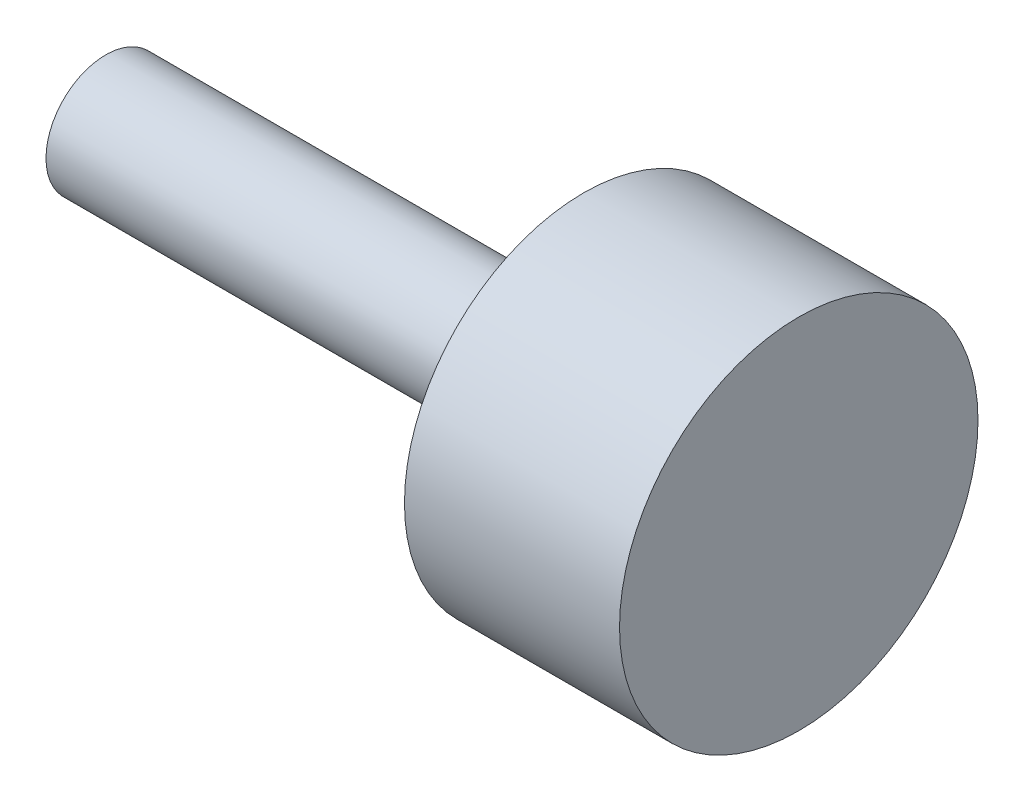
ISO-10303-21;
HEADER;
FILE_DESCRIPTION(('STEP AP214'),'2;1');
FILE_NAME('part.step','',(''),(''),'','','');
FILE_SCHEMA(('AUTOMOTIVE_DESIGN { 1 0 10303 214 1 1 1 1 }'));
ENDSEC;
DATA;
#1=APPLICATION_CONTEXT('core data for automotive mechanical design processes');
#2=APPLICATION_PROTOCOL_DEFINITION('international standard','automotive_design',2000,#1);
#3=PRODUCT_CONTEXT('',#1,'mechanical');
#4=PRODUCT('Part','Part','',(#3));
#5=PRODUCT_RELATED_PRODUCT_CATEGORY('part','',(#4));
#6=PRODUCT_DEFINITION_FORMATION('','',#4);
#7=PRODUCT_DEFINITION_CONTEXT('part definition',#1,'design');
#8=PRODUCT_DEFINITION('design','',#6,#7);
#9=PRODUCT_DEFINITION_SHAPE('','',#8);
#10=(LENGTH_UNIT() NAMED_UNIT(*) SI_UNIT(.MILLI.,.METRE.));
#11=(NAMED_UNIT(*) PLANE_ANGLE_UNIT() SI_UNIT($,.RADIAN.));
#12=(NAMED_UNIT(*) SI_UNIT($,.STERADIAN.) SOLID_ANGLE_UNIT());
#13=UNCERTAINTY_MEASURE_WITH_UNIT(LENGTH_MEASURE(1.E-05),#10,'distance_accuracy_value','');
#14=(GEOMETRIC_REPRESENTATION_CONTEXT(3) GLOBAL_UNCERTAINTY_ASSIGNED_CONTEXT((#13)) GLOBAL_UNIT_ASSIGNED_CONTEXT((#10,
#11,#12)) REPRESENTATION_CONTEXT('',''));
#15=CARTESIAN_POINT('',(0.,0.,0.));
#16=DIRECTION('',(0.,0.,1.));
#17=DIRECTION('',(1.,0.,0.));
#18=AXIS2_PLACEMENT_3D('',#15,#16,#17);
#19=CARTESIAN_POINT('',(-20.,0.,0.));
#20=DIRECTION('',(-1.,0.,0.));
#21=DIRECTION('',(0.,0.,1.));
#22=AXIS2_PLACEMENT_3D('',#19,#20,#21);
#23=PLANE('',#22);
#24=CARTESIAN_POINT('',(-20.,0.,0.));
#25=DIRECTION('',(-1.,0.,0.));
#26=DIRECTION('',(0.,0.,1.));
#27=AXIS2_PLACEMENT_3D('',#24,#25,#26);
#28=CIRCLE('',#27,2.5);
#29=CARTESIAN_POINT('',(-20.,0.,2.5));
#30=VERTEX_POINT('',#29);
#31=EDGE_CURVE('E10',#30,#30,#28,.T.);
#32=ORIENTED_EDGE('',*,*,#31,.T.);
#33=EDGE_LOOP('',(#32));
#34=FACE_BOUND('',#33,.T.);
#35=ADVANCED_FACE('F15',(#34),#23,.T.);
#36=CARTESIAN_POINT('',(-20.,0.,0.));
#37=DIRECTION('',(1.,0.,0.));
#38=DIRECTION('',(0.,0.,-1.));
#39=AXIS2_PLACEMENT_3D('',#36,#37,#38);
#40=CYLINDRICAL_SURFACE('',#39,2.5);
#41=ORIENTED_EDGE('',*,*,#31,.F.);
#42=EDGE_LOOP('',(#41));
#43=FACE_BOUND('',#42,.T.);
#44=CARTESIAN_POINT('',(0.,0.,0.));
#45=DIRECTION('',(-1.,0.,0.));
#46=DIRECTION('',(0.,0.,1.));
#47=AXIS2_PLACEMENT_3D('',#44,#45,#46);
#48=CIRCLE('',#47,2.5);
#49=CARTESIAN_POINT('',(0.,0.,2.5));
#50=VERTEX_POINT('',#49);
#51=EDGE_CURVE('E22',#50,#50,#48,.T.);
#52=ORIENTED_EDGE('',*,*,#51,.T.);
#53=EDGE_LOOP('',(#52));
#54=FACE_BOUND('',#53,.T.);
#55=ADVANCED_FACE('F52',(#43,#54),#40,.T.);
#56=CARTESIAN_POINT('',(0.,0.,0.));
#57=DIRECTION('',(1.,0.,0.));
#58=DIRECTION('',(0.,1.,0.));
#59=AXIS2_PLACEMENT_3D('',#56,#57,#58);
#60=PLANE('',#59);
#61=ORIENTED_EDGE('',*,*,#51,.F.);
#62=EDGE_LOOP('',(#61));
#63=FACE_BOUND('',#62,.T.);
#64=CARTESIAN_POINT('',(0.,0.,0.));
#65=DIRECTION('',(1.,0.,0.));
#66=DIRECTION('',(0.,0.,-1.));
#67=AXIS2_PLACEMENT_3D('',#64,#65,#66);
#68=CIRCLE('',#67,7.5);
#69=CARTESIAN_POINT('',(0.,0.,-7.5));
#70=VERTEX_POINT('',#69);
#71=EDGE_CURVE('E39',#70,#70,#68,.T.);
#72=ORIENTED_EDGE('',*,*,#71,.F.);
#73=EDGE_LOOP('',(#72));
#74=FACE_BOUND('',#73,.T.);
#75=ADVANCED_FACE('F49',(#63,#74),#60,.F.);
#76=CARTESIAN_POINT('',(9.,0.,0.));
#77=DIRECTION('',(1.,0.,0.));
#78=DIRECTION('',(0.,1.,0.));
#79=AXIS2_PLACEMENT_3D('',#76,#77,#78);
#80=PLANE('',#79);
#81=CARTESIAN_POINT('',(9.,0.,0.));
#82=DIRECTION('',(1.,0.,0.));
#83=DIRECTION('',(0.,0.,-1.));
#84=AXIS2_PLACEMENT_3D('',#81,#82,#83);
#85=CIRCLE('',#84,7.5);
#86=CARTESIAN_POINT('',(9.,0.,-7.5));
#87=VERTEX_POINT('',#86);
#88=EDGE_CURVE('E31',#87,#87,#85,.T.);
#89=ORIENTED_EDGE('',*,*,#88,.T.);
#90=EDGE_LOOP('',(#89));
#91=FACE_BOUND('',#90,.T.);
#92=ADVANCED_FACE('F51',(#91),#80,.T.);
#93=CARTESIAN_POINT('',(9.,0.,0.));
#94=DIRECTION('',(-1.,0.,0.));
#95=DIRECTION('',(0.,0.,1.));
#96=AXIS2_PLACEMENT_3D('',#93,#94,#95);
#97=CYLINDRICAL_SURFACE('',#96,7.5);
#98=ORIENTED_EDGE('',*,*,#88,.F.);
#99=EDGE_LOOP('',(#98));
#100=FACE_BOUND('',#99,.T.);
#101=ORIENTED_EDGE('',*,*,#71,.T.);
#102=EDGE_LOOP('',(#101));
#103=FACE_BOUND('',#102,.T.);
#104=ADVANCED_FACE('F47',(#100,#103),#97,.T.);
#105=CLOSED_SHELL('',(#35,#55,#75,#92,#104));
#106=MANIFOLD_SOLID_BREP('B1',#105);
#107=ADVANCED_BREP_SHAPE_REPRESENTATION('',(#18,#106),#14);
#108=SHAPE_DEFINITION_REPRESENTATION(#9,#107);
ENDSEC;
END-ISO-10303-21;
